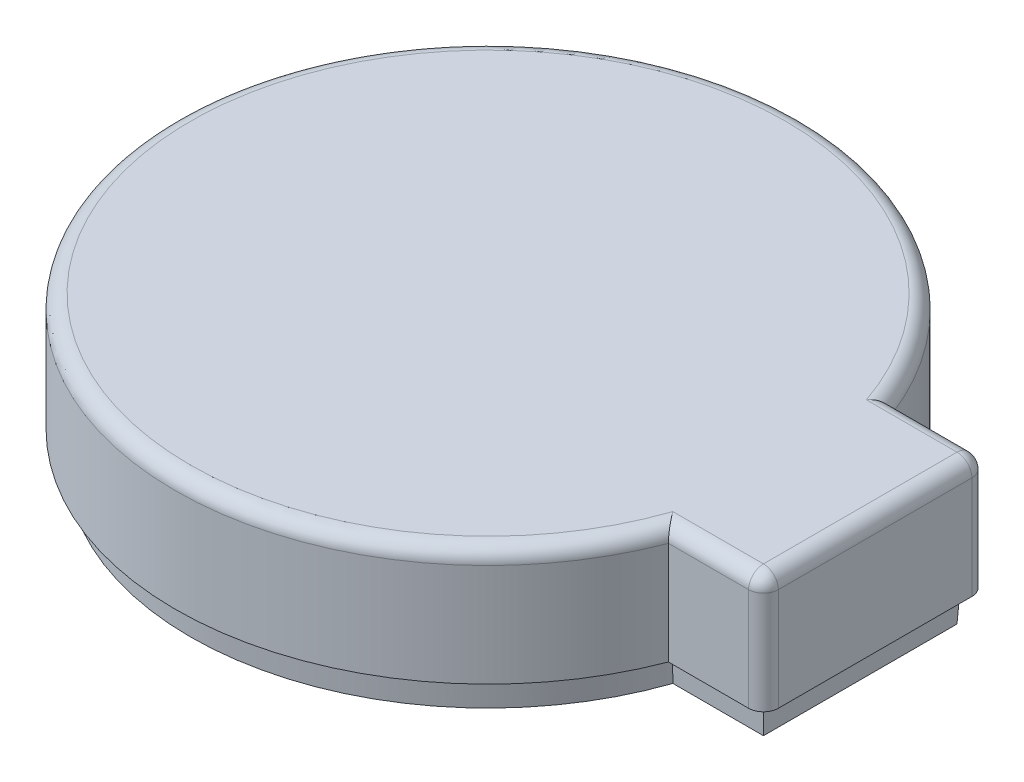
ISO-10303-21;
HEADER;
FILE_DESCRIPTION(('STEP AP214'),'2;1');
FILE_NAME('part.step','',(''),(''),'','','');
FILE_SCHEMA(('AUTOMOTIVE_DESIGN { 1 0 10303 214 1 1 1 1 }'));
ENDSEC;
DATA;
#1=APPLICATION_CONTEXT('core data for automotive mechanical design processes');
#2=APPLICATION_PROTOCOL_DEFINITION('international standard','automotive_design',2000,#1);
#3=PRODUCT_CONTEXT('',#1,'mechanical');
#4=PRODUCT('Part','Part','',(#3));
#5=PRODUCT_RELATED_PRODUCT_CATEGORY('part','',(#4));
#6=PRODUCT_DEFINITION_FORMATION('','',#4);
#7=PRODUCT_DEFINITION_CONTEXT('part definition',#1,'design');
#8=PRODUCT_DEFINITION('design','',#6,#7);
#9=PRODUCT_DEFINITION_SHAPE('','',#8);
#10=(LENGTH_UNIT() NAMED_UNIT(*) SI_UNIT(.MILLI.,.METRE.));
#11=(NAMED_UNIT(*) PLANE_ANGLE_UNIT() SI_UNIT($,.RADIAN.));
#12=(NAMED_UNIT(*) SI_UNIT($,.STERADIAN.) SOLID_ANGLE_UNIT());
#13=UNCERTAINTY_MEASURE_WITH_UNIT(LENGTH_MEASURE(1.E-05),#10,'distance_accuracy_value','');
#14=(GEOMETRIC_REPRESENTATION_CONTEXT(3) GLOBAL_UNCERTAINTY_ASSIGNED_CONTEXT((#13)) GLOBAL_UNIT_ASSIGNED_CONTEXT((#10,
#11,#12)) REPRESENTATION_CONTEXT('',''));
#15=CARTESIAN_POINT('',(0.,0.,0.));
#16=DIRECTION('',(0.,0.,1.));
#17=DIRECTION('',(1.,0.,0.));
#18=AXIS2_PLACEMENT_3D('',#15,#16,#17);
#19=CARTESIAN_POINT('',(25.,76.,-6.5));
#20=DIRECTION('',(0.,-1.,0.));
#21=DIRECTION('',(0.,0.,-1.));
#22=AXIS2_PLACEMENT_3D('',#19,#20,#21);
#23=CYLINDRICAL_SURFACE('',#22,1.);
#24=DIRECTION('',(0.,-1.,0.));
#25=VECTOR('',#24,1.);
#26=CARTESIAN_POINT('',(26.,76.,-6.5));
#27=LINE('',#26,#25);
#28=CARTESIAN_POINT('',(26.,70.1,-6.5));
#29=VERTEX_POINT('',#28);
#30=CARTESIAN_POINT('',(26.,77.,-6.5));
#31=VERTEX_POINT('',#30);
#32=EDGE_CURVE('E523',#29,#31,#27,.F.);
#33=ORIENTED_EDGE('',*,*,#32,.F.);
#34=CARTESIAN_POINT('',(25.,70.1,-6.5));
#35=DIRECTION('',(0.,-1.,0.));
#36=DIRECTION('',(0.,0.,-1.));
#37=AXIS2_PLACEMENT_3D('',#34,#35,#36);
#38=CIRCLE('',#37,1.);
#39=CARTESIAN_POINT('',(25.,70.1,-7.5));
#40=VERTEX_POINT('',#39);
#41=EDGE_CURVE('E468',#29,#40,#38,.F.);
#42=ORIENTED_EDGE('',*,*,#41,.T.);
#43=DIRECTION('',(0.,-1.,0.));
#44=VECTOR('',#43,1.);
#45=CARTESIAN_POINT('',(25.,76.,-7.5));
#46=LINE('',#45,#44);
#47=CARTESIAN_POINT('',(25.,77.,-7.5));
#48=VERTEX_POINT('',#47);
#49=EDGE_CURVE('E516',#48,#40,#46,.T.);
#50=ORIENTED_EDGE('',*,*,#49,.F.);
#51=CARTESIAN_POINT('',(25.,77.,-6.5));
#52=DIRECTION('',(0.,1.,0.));
#53=DIRECTION('',(0.,0.,1.));
#54=AXIS2_PLACEMENT_3D('',#51,#52,#53);
#55=CIRCLE('',#54,1.);
#56=EDGE_CURVE('E484',#48,#31,#55,.F.);
#57=ORIENTED_EDGE('',*,*,#56,.T.);
#58=EDGE_LOOP('',(#33,#42,#50,#57));
#59=FACE_BOUND('',#58,.T.);
#60=ADVANCED_FACE('F289',(#59),#23,.T.);
#61=CARTESIAN_POINT('',(25.,76.,6.5));
#62=DIRECTION('',(0.,1.,0.));
#63=DIRECTION('',(0.,0.,1.));
#64=AXIS2_PLACEMENT_3D('',#61,#62,#63);
#65=CYLINDRICAL_SURFACE('',#64,1.);
#66=DIRECTION('',(0.,-1.,0.));
#67=VECTOR('',#66,1.);
#68=CARTESIAN_POINT('',(25.,78.,7.5));
#69=LINE('',#68,#67);
#70=CARTESIAN_POINT('',(25.,70.1,7.5));
#71=VERTEX_POINT('',#70);
#72=CARTESIAN_POINT('',(25.,77.,7.5));
#73=VERTEX_POINT('',#72);
#74=EDGE_CURVE('E521',#71,#73,#69,.F.);
#75=ORIENTED_EDGE('',*,*,#74,.F.);
#76=CARTESIAN_POINT('',(25.,70.1,6.5));
#77=DIRECTION('',(0.,-1.,0.));
#78=DIRECTION('',(0.,0.,-1.));
#79=AXIS2_PLACEMENT_3D('',#76,#77,#78);
#80=CIRCLE('',#79,1.);
#81=CARTESIAN_POINT('',(26.,70.1,6.5));
#82=VERTEX_POINT('',#81);
#83=EDGE_CURVE('E465',#71,#82,#80,.F.);
#84=ORIENTED_EDGE('',*,*,#83,.T.);
#85=DIRECTION('',(0.,-1.,0.));
#86=VECTOR('',#85,1.);
#87=CARTESIAN_POINT('',(26.,-2.,6.5));
#88=LINE('',#87,#86);
#89=CARTESIAN_POINT('',(26.,77.,6.5));
#90=VERTEX_POINT('',#89);
#91=EDGE_CURVE('E527',#90,#82,#88,.T.);
#92=ORIENTED_EDGE('',*,*,#91,.F.);
#93=CARTESIAN_POINT('',(25.,77.,6.5));
#94=DIRECTION('',(0.,1.,0.));
#95=DIRECTION('',(0.,0.,1.));
#96=AXIS2_PLACEMENT_3D('',#93,#94,#95);
#97=CIRCLE('',#96,1.);
#98=EDGE_CURVE('E586',#90,#73,#97,.F.);
#99=ORIENTED_EDGE('',*,*,#98,.T.);
#100=EDGE_LOOP('',(#75,#84,#92,#99));
#101=FACE_BOUND('',#100,.T.);
#102=ADVANCED_FACE('F572',(#101),#65,.T.);
#103=CARTESIAN_POINT('',(26.,76.,0.));
#104=DIRECTION('',(1.,0.,0.));
#105=DIRECTION('',(0.,0.,-1.));
#106=AXIS2_PLACEMENT_3D('',#103,#104,#105);
#107=PLANE('',#106);
#108=ORIENTED_EDGE('',*,*,#91,.T.);
#109=DIRECTION('',(0.,0.,-1.));
#110=VECTOR('',#109,1.);
#111=CARTESIAN_POINT('',(26.,70.1,0.));
#112=LINE('',#111,#110);
#113=EDGE_CURVE('E471',#82,#29,#112,.T.);
#114=ORIENTED_EDGE('',*,*,#113,.T.);
#115=ORIENTED_EDGE('',*,*,#32,.T.);
#116=DIRECTION('',(0.,0.,-1.));
#117=VECTOR('',#116,1.);
#118=CARTESIAN_POINT('',(26.,77.,0.));
#119=LINE('',#118,#117);
#120=EDGE_CURVE('E525',#31,#90,#119,.F.);
#121=ORIENTED_EDGE('',*,*,#120,.T.);
#122=EDGE_LOOP('',(#108,#114,#115,#121));
#123=FACE_BOUND('',#122,.T.);
#124=ADVANCED_FACE('F574',(#123),#107,.T.);
#125=CARTESIAN_POINT('',(0.,76.,7.5));
#126=DIRECTION('',(0.,0.,-1.));
#127=DIRECTION('',(-1.,0.,0.));
#128=AXIS2_PLACEMENT_3D('',#125,#126,#127);
#129=PLANE('',#128);
#130=DIRECTION('',(-1.,0.,0.));
#131=VECTOR('',#130,1.);
#132=CARTESIAN_POINT('',(0.,70.1,7.5));
#133=LINE('',#132,#131);
#134=CARTESIAN_POINT('',(19.615045245933,70.1,7.5));
#135=VERTEX_POINT('',#134);
#136=EDGE_CURVE('E463',#71,#135,#133,.T.);
#137=ORIENTED_EDGE('',*,*,#136,.F.);
#138=ORIENTED_EDGE('',*,*,#74,.T.);
#139=DIRECTION('',(1.,0.,0.));
#140=VECTOR('',#139,1.);
#141=CARTESIAN_POINT('',(19.615045245933,77.,7.5));
#142=LINE('',#141,#140);
#143=CARTESIAN_POINT('',(19.615045245933,77.,7.5));
#144=VERTEX_POINT('',#143);
#145=EDGE_CURVE('E519',#73,#144,#142,.F.);
#146=ORIENTED_EDGE('',*,*,#145,.T.);
#147=DIRECTION('',(0.,-1.,0.));
#148=VECTOR('',#147,1.);
#149=CARTESIAN_POINT('',(19.615045245933,76.,7.5));
#150=LINE('',#149,#148);
#151=EDGE_CURVE('E497',#144,#135,#150,.T.);
#152=ORIENTED_EDGE('',*,*,#151,.T.);
#153=EDGE_LOOP('',(#137,#138,#146,#152));
#154=FACE_BOUND('',#153,.T.);
#155=ADVANCED_FACE('F624',(#154),#129,.F.);
#156=CARTESIAN_POINT('',(0.,76.,0.));
#157=DIRECTION('',(0.,-1.,0.));
#158=DIRECTION('',(0.,0.,-1.));
#159=AXIS2_PLACEMENT_3D('',#156,#157,#158);
#160=CYLINDRICAL_SURFACE('',#159,21.);
#161=CARTESIAN_POINT('',(0.,70.1,0.));
#162=DIRECTION('',(0.,-1.,0.));
#163=DIRECTION('',(0.,0.,-1.));
#164=AXIS2_PLACEMENT_3D('',#161,#162,#163);
#165=CIRCLE('',#164,21.);
#166=CARTESIAN_POINT('',(19.615045245933,70.1,-7.5));
#167=VERTEX_POINT('',#166);
#168=EDGE_CURVE('E304',#135,#167,#165,.T.);
#169=ORIENTED_EDGE('',*,*,#168,.F.);
#170=ORIENTED_EDGE('',*,*,#151,.F.);
#171=CARTESIAN_POINT('',(0.,77.,0.));
#172=DIRECTION('',(0.,1.,0.));
#173=DIRECTION('',(0.,0.,1.));
#174=AXIS2_PLACEMENT_3D('',#171,#172,#173);
#175=CIRCLE('',#174,21.);
#176=CARTESIAN_POINT('',(19.615045245933,77.,-7.5));
#177=VERTEX_POINT('',#176);
#178=EDGE_CURVE('E297',#144,#177,#175,.F.);
#179=ORIENTED_EDGE('',*,*,#178,.T.);
#180=DIRECTION('',(0.,-1.,0.));
#181=VECTOR('',#180,1.);
#182=CARTESIAN_POINT('',(19.615045245933,76.,-7.5));
#183=LINE('',#182,#181);
#184=EDGE_CURVE('E500',#177,#167,#183,.T.);
#185=ORIENTED_EDGE('',*,*,#184,.T.);
#186=EDGE_LOOP('',(#169,#170,#179,#185));
#187=FACE_BOUND('',#186,.T.);
#188=ADVANCED_FACE('F612',(#187),#160,.T.);
#189=CARTESIAN_POINT('',(0.,76.,-7.5));
#190=DIRECTION('',(0.,0.,-1.));
#191=DIRECTION('',(-1.,0.,0.));
#192=AXIS2_PLACEMENT_3D('',#189,#190,#191);
#193=PLANE('',#192);
#194=ORIENTED_EDGE('',*,*,#49,.T.);
#195=DIRECTION('',(-1.,0.,0.));
#196=VECTOR('',#195,1.);
#197=CARTESIAN_POINT('',(0.,70.1,-7.5));
#198=LINE('',#197,#196);
#199=EDGE_CURVE('E13',#40,#167,#198,.T.);
#200=ORIENTED_EDGE('',*,*,#199,.T.);
#201=ORIENTED_EDGE('',*,*,#184,.F.);
#202=DIRECTION('',(-1.,0.,0.));
#203=VECTOR('',#202,1.);
#204=CARTESIAN_POINT('',(0.,77.,-7.5));
#205=LINE('',#204,#203);
#206=EDGE_CURVE('E504',#177,#48,#205,.F.);
#207=ORIENTED_EDGE('',*,*,#206,.T.);
#208=EDGE_LOOP('',(#194,#200,#201,#207));
#209=FACE_BOUND('',#208,.T.);
#210=ADVANCED_FACE('F614',(#209),#193,.T.);
#211=CARTESIAN_POINT('',(0.,78.,0.));
#212=DIRECTION('',(0.,1.,0.));
#213=DIRECTION('',(0.,0.,1.));
#214=AXIS2_PLACEMENT_3D('',#211,#212,#213);
#215=PLANE('',#214);
#216=DIRECTION('',(1.,0.,0.));
#217=VECTOR('',#216,1.);
#218=CARTESIAN_POINT('',(26.,78.,6.5));
#219=LINE('',#218,#217);
#220=CARTESIAN_POINT('',(18.9142803193777,78.,6.5));
#221=VERTEX_POINT('',#220);
#222=CARTESIAN_POINT('',(25.,78.,6.5));
#223=VERTEX_POINT('',#222);
#224=EDGE_CURVE('E534',#221,#223,#219,.T.);
#225=ORIENTED_EDGE('',*,*,#224,.T.);
#226=DIRECTION('',(0.,0.,-1.));
#227=VECTOR('',#226,1.);
#228=CARTESIAN_POINT('',(25.,78.,0.));
#229=LINE('',#228,#227);
#230=CARTESIAN_POINT('',(25.,78.,-6.5));
#231=VERTEX_POINT('',#230);
#232=EDGE_CURVE('E536',#223,#231,#229,.T.);
#233=ORIENTED_EDGE('',*,*,#232,.T.);
#234=DIRECTION('',(-1.,0.,0.));
#235=VECTOR('',#234,1.);
#236=CARTESIAN_POINT('',(0.,78.,-6.5));
#237=LINE('',#236,#235);
#238=CARTESIAN_POINT('',(18.9142803193777,78.,-6.5));
#239=VERTEX_POINT('',#238);
#240=EDGE_CURVE('E532',#231,#239,#237,.T.);
#241=ORIENTED_EDGE('',*,*,#240,.T.);
#242=CARTESIAN_POINT('',(0.,78.,0.));
#243=DIRECTION('',(0.,1.,0.));
#244=DIRECTION('',(0.,0.,1.));
#245=AXIS2_PLACEMENT_3D('',#242,#243,#244);
#246=CIRCLE('',#245,20.);
#247=EDGE_CURVE('E530',#239,#221,#246,.T.);
#248=ORIENTED_EDGE('',*,*,#247,.T.);
#249=EDGE_LOOP('',(#225,#233,#241,#248));
#250=FACE_BOUND('',#249,.T.);
#251=ADVANCED_FACE('F565',(#250),#215,.T.);
#252=CARTESIAN_POINT('',(0.,77.,-6.5));
#253=DIRECTION('',(-1.,0.,0.));
#254=DIRECTION('',(0.,0.,1.));
#255=AXIS2_PLACEMENT_3D('',#252,#253,#254);
#256=CYLINDRICAL_SURFACE('',#255,1.);
#257=CARTESIAN_POINT('',(19.615045245933,77.,-7.5));
#258=CARTESIAN_POINT('',(19.6150464901498,77.0245913883514,-7.50000195074469));
#259=CARTESIAN_POINT('',(19.6144204421989,77.049169455449,-7.49909216770085));
#260=CARTESIAN_POINT('',(19.6119320594645,77.0981199397787,-7.49547691718047));
#261=CARTESIAN_POINT('',(19.6100702475772,77.1224924395784,-7.49277220920138));
#262=CARTESIAN_POINT('',(19.6026878164083,77.1947705444246,-7.48204978646102));
#263=CARTESIAN_POINT('',(19.5953696888519,77.2421395994663,-7.47142300065398));
#264=CARTESIAN_POINT('',(19.5763404742697,77.33393471167,-7.44381546415088));
#265=CARTESIAN_POINT('',(19.5646349450327,77.3783644088734,-7.4268427522926));
#266=CARTESIAN_POINT('',(19.537373263556,77.4634561435416,-7.38736180159154));
#267=CARTESIAN_POINT('',(19.5218128624886,77.5041139552225,-7.36484745495401));
#268=CARTESIAN_POINT('',(19.4863706136538,77.5833992284021,-7.31364100918386));
#269=CARTESIAN_POINT('',(19.4662781782195,77.6217371167018,-7.28464893557632));
#270=CARTESIAN_POINT('',(19.4231407350394,77.6929697069104,-7.22251594235774));
#271=CARTESIAN_POINT('',(19.400094988175,77.7258630414845,-7.18937398421209));
#272=CARTESIAN_POINT('',(19.3476213070707,77.7910797850254,-7.11406124326996));
#273=CARTESIAN_POINT('',(19.3177705525009,77.8223881827772,-7.07130738047668));
#274=CARTESIAN_POINT('',(19.2557258167357,77.8773582086508,-6.98266710364924));
#275=CARTESIAN_POINT('',(19.2235292504516,77.9010112394917,-6.93677723729668));
#276=CARTESIAN_POINT('',(19.1515447819292,77.9443325286028,-6.83445002303998));
#277=CARTESIAN_POINT('',(19.1114370321131,77.9625065233977,-6.77760607226738));
#278=CARTESIAN_POINT('',(19.0300037501768,77.9884535192871,-6.66256994521675));
#279=CARTESIAN_POINT('',(18.988680282891,77.9962432207276,-6.60438008720164));
#280=CARTESIAN_POINT('',(18.9374949570389,77.9995634848672,-6.53254148535724));
#281=CARTESIAN_POINT('',(18.9277796966127,77.9999138876318,-6.51891665325401));
#282=CARTESIAN_POINT('',(18.9167990659669,77.9999953276404,-6.50352908627626));
#283=CARTESIAN_POINT('',(18.9155397417105,77.9999999974932,-6.50176452402142));
#284=CARTESIAN_POINT('',(18.9142803193777,78.,-6.5));
#285=B_SPLINE_CURVE_WITH_KNOTS('',3,(#257,#258,#259,#260,#261,#262,#263,#264,#265,#266,#267,
#268,#269,#270,#271,#272,#273,#274,#275,#276,#277,#278,#279,#280,#281,#282,#283,#284),
.UNSPECIFIED.,.F.,.F.,(4,2,2,2,2,2,2,2,2,2,2,2,2,4),(0.,0.073723631162768,0.147416087072646,
0.293905282465476,0.44020953481274,0.586675766339752,0.742375312783305,0.898113902182855,
1.07989412202351,1.26187778555274,1.47677325615916,1.69132270651525,1.74153133340873,
1.7480348925106),.UNSPECIFIED.);
#286=EDGE_CURVE('E547',#177,#239,#285,.T.);
#287=ORIENTED_EDGE('',*,*,#286,.T.);
#288=ORIENTED_EDGE('',*,*,#240,.F.);
#289=CARTESIAN_POINT('',(25.,77.,-6.5));
#290=DIRECTION('',(1.,0.,0.));
#291=DIRECTION('',(0.,0.,-1.));
#292=AXIS2_PLACEMENT_3D('',#289,#290,#291);
#293=CIRCLE('',#292,1.);
#294=EDGE_CURVE('E542',#48,#231,#293,.T.);
#295=ORIENTED_EDGE('',*,*,#294,.F.);
#296=ORIENTED_EDGE('',*,*,#206,.F.);
#297=EDGE_LOOP('',(#287,#288,#295,#296));
#298=FACE_BOUND('',#297,.T.);
#299=ADVANCED_FACE('F561',(#298),#256,.T.);
#300=CARTESIAN_POINT('',(0.,77.,0.));
#301=DIRECTION('',(0.,1.,0.));
#302=DIRECTION('',(0.,0.,1.));
#303=AXIS2_PLACEMENT_3D('',#300,#301,#302);
#304=TOROIDAL_SURFACE('',#303,20.,1.);
#305=CARTESIAN_POINT('',(19.615045245933,77.,7.5));
#306=CARTESIAN_POINT('',(19.6150464901498,77.0245913883515,7.50000195074469));
#307=CARTESIAN_POINT('',(19.6144204421989,77.049169455449,7.49909216770085));
#308=CARTESIAN_POINT('',(19.6119320594645,77.0981199397787,7.49547691718047));
#309=CARTESIAN_POINT('',(19.6100702475772,77.1224924395784,7.49277220920137));
#310=CARTESIAN_POINT('',(19.6026878164083,77.1947705444246,7.48204978646102));
#311=CARTESIAN_POINT('',(19.5953696888519,77.2421395994663,7.47142300065398));
#312=CARTESIAN_POINT('',(19.5763404742697,77.33393471167,7.44381546415088));
#313=CARTESIAN_POINT('',(19.5646349450327,77.3783644088734,7.4268427522926));
#314=CARTESIAN_POINT('',(19.537373263556,77.4634561435416,7.38736180159154));
#315=CARTESIAN_POINT('',(19.5218128624886,77.5041139552225,7.36484745495401));
#316=CARTESIAN_POINT('',(19.4863706136538,77.5833992284021,7.31364100918385));
#317=CARTESIAN_POINT('',(19.4662781782195,77.6217371167018,7.28464893557632));
#318=CARTESIAN_POINT('',(19.4231407350394,77.6929697069104,7.22251594235775));
#319=CARTESIAN_POINT('',(19.400094988175,77.7258630414845,7.18937398421209));
#320=CARTESIAN_POINT('',(19.3476213070707,77.7910797850254,7.11406124326997));
#321=CARTESIAN_POINT('',(19.3177705525009,77.8223881827772,7.07130738047669));
#322=CARTESIAN_POINT('',(19.2557258167357,77.8773582086507,6.98266710364924));
#323=CARTESIAN_POINT('',(19.2235292504516,77.9010112394917,6.93677723729668));
#324=CARTESIAN_POINT('',(19.1515447819292,77.9443325286028,6.83445002303997));
#325=CARTESIAN_POINT('',(19.1114370321131,77.9625065233977,6.77760607226737));
#326=CARTESIAN_POINT('',(19.0300037501768,77.9884535192871,6.66256994521675));
#327=CARTESIAN_POINT('',(18.988680282891,77.9962432207276,6.60438008720164));
#328=CARTESIAN_POINT('',(18.9374949570389,77.9995634848672,6.53254148535724));
#329=CARTESIAN_POINT('',(18.9277796966127,77.9999138876318,6.51891665325401));
#330=CARTESIAN_POINT('',(18.9167990659669,77.9999953276404,6.50352908627626));
#331=CARTESIAN_POINT('',(18.9155397417105,77.9999999974932,6.50176452402141));
#332=CARTESIAN_POINT('',(18.9142803193777,78.,6.5));
#333=B_SPLINE_CURVE_WITH_KNOTS('',3,(#305,#306,#307,#308,#309,#310,#311,#312,#313,#314,#315,
#316,#317,#318,#319,#320,#321,#322,#323,#324,#325,#326,#327,#328,#329,#330,#331,#332),
.UNSPECIFIED.,.F.,.F.,(4,2,2,2,2,2,2,2,2,2,2,2,2,4),(0.,0.0737236311627818,0.147416087072646,
0.293905282465476,0.44020953481274,0.586675766339752,0.742375312783303,0.898113902182835,
1.07989412202349,1.26187778555274,1.47677325615916,1.69132270651525,1.74153133340873,
1.7480348925106),.UNSPECIFIED.);
#334=EDGE_CURVE('E580',#144,#221,#333,.T.);
#335=ORIENTED_EDGE('',*,*,#334,.T.);
#336=ORIENTED_EDGE('',*,*,#247,.F.);
#337=ORIENTED_EDGE('',*,*,#286,.F.);
#338=ORIENTED_EDGE('',*,*,#178,.F.);
#339=EDGE_LOOP('',(#335,#336,#337,#338));
#340=FACE_BOUND('',#339,.T.);
#341=ADVANCED_FACE('F558',(#340),#304,.T.);
#342=CARTESIAN_POINT('',(0.,77.,6.5));
#343=DIRECTION('',(-1.,0.,0.));
#344=DIRECTION('',(0.,0.,1.));
#345=AXIS2_PLACEMENT_3D('',#342,#343,#344);
#346=CYLINDRICAL_SURFACE('',#345,1.);
#347=ORIENTED_EDGE('',*,*,#334,.F.);
#348=ORIENTED_EDGE('',*,*,#145,.F.);
#349=CARTESIAN_POINT('',(25.,77.,6.5));
#350=DIRECTION('',(1.,0.,0.));
#351=DIRECTION('',(0.,0.,-1.));
#352=AXIS2_PLACEMENT_3D('',#349,#350,#351);
#353=CIRCLE('',#352,1.);
#354=EDGE_CURVE('E489',#223,#73,#353,.T.);
#355=ORIENTED_EDGE('',*,*,#354,.F.);
#356=ORIENTED_EDGE('',*,*,#224,.F.);
#357=EDGE_LOOP('',(#347,#348,#355,#356));
#358=FACE_BOUND('',#357,.T.);
#359=ADVANCED_FACE('F570',(#358),#346,.T.);
#360=CARTESIAN_POINT('',(25.,77.,0.));
#361=DIRECTION('',(0.,0.,-1.));
#362=DIRECTION('',(-1.,0.,0.));
#363=AXIS2_PLACEMENT_3D('',#360,#361,#362);
#364=CYLINDRICAL_SURFACE('',#363,1.);
#365=CARTESIAN_POINT('',(25.,77.,6.5));
#366=DIRECTION('',(0.,0.,1.));
#367=DIRECTION('',(1.,0.,0.));
#368=AXIS2_PLACEMENT_3D('',#365,#366,#367);
#369=CIRCLE('',#368,1.);
#370=EDGE_CURVE('E556',#223,#90,#369,.F.);
#371=ORIENTED_EDGE('',*,*,#370,.T.);
#372=ORIENTED_EDGE('',*,*,#120,.F.);
#373=CARTESIAN_POINT('',(25.,77.,-6.5));
#374=DIRECTION('',(0.,0.,-1.));
#375=DIRECTION('',(-1.,0.,0.));
#376=AXIS2_PLACEMENT_3D('',#373,#374,#375);
#377=CIRCLE('',#376,1.);
#378=EDGE_CURVE('E544',#231,#31,#377,.T.);
#379=ORIENTED_EDGE('',*,*,#378,.F.);
#380=ORIENTED_EDGE('',*,*,#232,.F.);
#381=EDGE_LOOP('',(#371,#372,#379,#380));
#382=FACE_BOUND('',#381,.T.);
#383=ADVANCED_FACE('F567',(#382),#364,.T.);
#384=CARTESIAN_POINT('',(25.,77.,6.5));
#385=DIRECTION('',(0.,0.,1.));
#386=DIRECTION('',(1.,0.,0.));
#387=AXIS2_PLACEMENT_3D('',#384,#385,#386);
#388=SPHERICAL_SURFACE('',#387,1.);
#389=ORIENTED_EDGE('',*,*,#370,.F.);
#390=ORIENTED_EDGE('',*,*,#354,.T.);
#391=ORIENTED_EDGE('',*,*,#98,.F.);
#392=EDGE_LOOP('',(#389,#390,#391));
#393=FACE_BOUND('',#392,.T.);
#394=ADVANCED_FACE('F291',(#393),#388,.T.);
#395=CARTESIAN_POINT('',(25.,77.,-6.5));
#396=DIRECTION('',(0.,0.,1.));
#397=DIRECTION('',(1.,0.,0.));
#398=AXIS2_PLACEMENT_3D('',#395,#396,#397);
#399=SPHERICAL_SURFACE('',#398,1.);
#400=ORIENTED_EDGE('',*,*,#294,.T.);
#401=ORIENTED_EDGE('',*,*,#378,.T.);
#402=ORIENTED_EDGE('',*,*,#56,.F.);
#403=EDGE_LOOP('',(#400,#401,#402));
#404=FACE_BOUND('',#403,.T.);
#405=ADVANCED_FACE('F641',(#404),#399,.T.);
#406=CARTESIAN_POINT('',(25.,68.,0.));
#407=DIRECTION('',(-0.998629534754574,0.0523359562429438,0.));
#408=DIRECTION('',(-0.0523359562429438,-0.998629534754574,0.));
#409=AXIS2_PLACEMENT_3D('',#406,#407,#408);
#410=PLANE('',#409);
#411=DIRECTION('',(0.,0.,1.));
#412=VECTOR('',#411,1.);
#413=CARTESIAN_POINT('',(25.,68.,0.));
#414=LINE('',#413,#412);
#415=CARTESIAN_POINT('',(25.,68.,-6.5));
#416=VERTEX_POINT('',#415);
#417=CARTESIAN_POINT('',(25.,68.,6.5));
#418=VERTEX_POINT('',#417);
#419=EDGE_CURVE('E416',#416,#418,#414,.T.);
#420=ORIENTED_EDGE('',*,*,#419,.F.);
#421=DIRECTION('',(-0.0522644276887139,-0.997264688634237,0.0522644276887139));
#422=VECTOR('',#421,1.);
#423=CARTESIAN_POINT('',(24.9317107399593,66.6969632948592,-6.43171073995928));
#424=LINE('',#423,#422);
#425=CARTESIAN_POINT('',(25.1100563364944,70.1,-6.61005633649439));
#426=VERTEX_POINT('',#425);
#427=EDGE_CURVE('E407',#426,#416,#424,.T.);
#428=ORIENTED_EDGE('',*,*,#427,.F.);
#429=DIRECTION('',(0.,0.,-1.));
#430=VECTOR('',#429,1.);
#431=CARTESIAN_POINT('',(25.1100563364944,70.1,0.));
#432=LINE('',#431,#430);
#433=CARTESIAN_POINT('',(25.1100563364944,70.1,6.61005633649439));
#434=VERTEX_POINT('',#433);
#435=EDGE_CURVE('E455',#426,#434,#432,.F.);
#436=ORIENTED_EDGE('',*,*,#435,.T.);
#437=DIRECTION('',(0.0522644276887139,0.997264688634237,0.0522644276887139));
#438=VECTOR('',#437,1.);
#439=CARTESIAN_POINT('',(24.9317107399593,66.6969632948592,6.43171073995928));
#440=LINE('',#439,#438);
#441=EDGE_CURVE('E433',#434,#418,#440,.F.);
#442=ORIENTED_EDGE('',*,*,#441,.T.);
#443=EDGE_LOOP('',(#420,#428,#436,#442));
#444=FACE_BOUND('',#443,.T.);
#445=ADVANCED_FACE('F440',(#444),#410,.F.);
#446=CARTESIAN_POINT('',(0.,68.,-6.5));
#447=DIRECTION('',(0.,0.0523359562429438,0.998629534754574));
#448=DIRECTION('',(0.,-0.998629534754574,0.0523359562429438));
#449=AXIS2_PLACEMENT_3D('',#446,#447,#448);
#450=PLANE('',#449);
#451=DIRECTION('',(1.,0.,0.));
#452=VECTOR('',#451,1.);
#453=CARTESIAN_POINT('',(0.,68.,-6.5));
#454=LINE('',#453,#452);
#455=CARTESIAN_POINT('',(18.9142803193777,68.,-6.5));
#456=VERTEX_POINT('',#455);
#457=EDGE_CURVE('E411',#456,#416,#454,.T.);
#458=ORIENTED_EDGE('',*,*,#457,.F.);
#459=CARTESIAN_POINT('',(18.9926701936655,70.1,-6.61005633649439));
#460=CARTESIAN_POINT('',(18.979632194891,69.7499989956266,-6.59171356110834));
#461=CARTESIAN_POINT('',(18.9665807059798,69.3999984934406,-6.57337081204082));
#462=CARTESIAN_POINT('',(18.9404507478839,68.6999984934406,-6.53668536654269));
#463=CARTESIAN_POINT('',(18.9273722786992,68.3499989956266,-6.51834267011208));
#464=CARTESIAN_POINT('',(18.9142803193777,68.,-6.5));
#465=B_SPLINE_CURVE_WITH_KNOTS('',3,(#459,#460,#461,#462,#463,#464),.UNSPECIFIED.,.F.,.F.,(4,2,
4),(0.,1.05217125223487,2.10434250447829),.UNSPECIFIED.);
#466=CARTESIAN_POINT('',(18.9926701936655,70.1,-6.61005633649439));
#467=VERTEX_POINT('',#466);
#468=EDGE_CURVE('E399',#467,#456,#465,.T.);
#469=ORIENTED_EDGE('',*,*,#468,.F.);
#470=DIRECTION('',(-1.,0.,0.));
#471=VECTOR('',#470,1.);
#472=CARTESIAN_POINT('',(0.,70.1,-6.61005633649439));
#473=LINE('',#472,#471);
#474=EDGE_CURVE('E453',#467,#426,#473,.F.);
#475=ORIENTED_EDGE('',*,*,#474,.T.);
#476=ORIENTED_EDGE('',*,*,#427,.T.);
#477=EDGE_LOOP('',(#458,#469,#475,#476));
#478=FACE_BOUND('',#477,.T.);
#479=ADVANCED_FACE('F412',(#478),#450,.F.);
#480=CARTESIAN_POINT('',(0.,68.,0.));
#481=DIRECTION('',(0.,1.,0.));
#482=DIRECTION('',(0.,0.,-1.));
#483=AXIS2_PLACEMENT_3D('',#480,#481,#482);
#484=CONICAL_SURFACE('',#483,20.,0.0523598775598298);
#485=CARTESIAN_POINT('',(0.,68.,0.));
#486=DIRECTION('',(0.,-1.,0.));
#487=DIRECTION('',(0.,0.,-1.));
#488=AXIS2_PLACEMENT_3D('',#485,#486,#487);
#489=CIRCLE('',#488,20.);
#490=CARTESIAN_POINT('',(18.9142803193777,68.,6.5));
#491=VERTEX_POINT('',#490);
#492=EDGE_CURVE('E311',#456,#491,#489,.F.);
#493=ORIENTED_EDGE('',*,*,#492,.T.);
#494=CARTESIAN_POINT('',(18.9926701936655,70.1,6.61005633649438));
#495=CARTESIAN_POINT('',(18.979632194891,69.7499989956266,6.59171356110834));
#496=CARTESIAN_POINT('',(18.9665807059798,69.3999984934406,6.57337081204082));
#497=CARTESIAN_POINT('',(18.9404507478839,68.6999984934406,6.53668536654269));
#498=CARTESIAN_POINT('',(18.9273722786992,68.3499989956266,6.51834267011208));
#499=CARTESIAN_POINT('',(18.9142803193777,68.,6.5));
#500=B_SPLINE_CURVE_WITH_KNOTS('',3,(#494,#495,#496,#497,#498,#499),.UNSPECIFIED.,.F.,.F.,(4,2,
4),(0.,1.05217125223487,2.10434250447829),.UNSPECIFIED.);
#501=CARTESIAN_POINT('',(18.9926701936655,70.1,6.61005633649438));
#502=VERTEX_POINT('',#501);
#503=EDGE_CURVE('E408',#502,#491,#500,.T.);
#504=ORIENTED_EDGE('',*,*,#503,.F.);
#505=CARTESIAN_POINT('',(0.,70.1,0.));
#506=DIRECTION('',(0.,-1.,0.));
#507=DIRECTION('',(0.,0.,-1.));
#508=AXIS2_PLACEMENT_3D('',#505,#506,#507);
#509=CIRCLE('',#508,20.1100563364944);
#510=EDGE_CURVE('E403',#467,#502,#509,.F.);
#511=ORIENTED_EDGE('',*,*,#510,.F.);
#512=ORIENTED_EDGE('',*,*,#468,.T.);
#513=EDGE_LOOP('',(#493,#504,#511,#512));
#514=FACE_BOUND('',#513,.T.);
#515=ADVANCED_FACE('F401',(#514),#484,.T.);
#516=CARTESIAN_POINT('',(0.,68.,6.5));
#517=DIRECTION('',(0.,0.0523359562429438,-0.998629534754574));
#518=DIRECTION('',(0.,0.998629534754574,0.0523359562429438));
#519=AXIS2_PLACEMENT_3D('',#516,#517,#518);
#520=PLANE('',#519);
#521=DIRECTION('',(1.,0.,0.));
#522=VECTOR('',#521,1.);
#523=CARTESIAN_POINT('',(0.,68.,6.5));
#524=LINE('',#523,#522);
#525=EDGE_CURVE('E421',#491,#418,#524,.T.);
#526=ORIENTED_EDGE('',*,*,#525,.T.);
#527=ORIENTED_EDGE('',*,*,#441,.F.);
#528=DIRECTION('',(1.,0.,0.));
#529=VECTOR('',#528,1.);
#530=CARTESIAN_POINT('',(0.,70.1,6.61005633649438));
#531=LINE('',#530,#529);
#532=EDGE_CURVE('E458',#502,#434,#531,.T.);
#533=ORIENTED_EDGE('',*,*,#532,.F.);
#534=ORIENTED_EDGE('',*,*,#503,.T.);
#535=EDGE_LOOP('',(#526,#527,#533,#534));
#536=FACE_BOUND('',#535,.T.);
#537=ADVANCED_FACE('F441',(#536),#520,.F.);
#538=CARTESIAN_POINT('',(0.,70.1,0.));
#539=DIRECTION('',(0.,-1.,0.));
#540=DIRECTION('',(0.,0.,-1.));
#541=AXIS2_PLACEMENT_3D('',#538,#539,#540);
#542=PLANE('',#541);
#543=ORIENTED_EDGE('',*,*,#83,.F.);
#544=ORIENTED_EDGE('',*,*,#136,.T.);
#545=ORIENTED_EDGE('',*,*,#168,.T.);
#546=ORIENTED_EDGE('',*,*,#199,.F.);
#547=ORIENTED_EDGE('',*,*,#41,.F.);
#548=ORIENTED_EDGE('',*,*,#113,.F.);
#549=EDGE_LOOP('',(#543,#544,#545,#546,#547,#548));
#550=FACE_BOUND('',#549,.T.);
#551=ORIENTED_EDGE('',*,*,#435,.F.);
#552=ORIENTED_EDGE('',*,*,#474,.F.);
#553=ORIENTED_EDGE('',*,*,#510,.T.);
#554=ORIENTED_EDGE('',*,*,#532,.T.);
#555=EDGE_LOOP('',(#551,#552,#553,#554));
#556=FACE_BOUND('',#555,.T.);
#557=ADVANCED_FACE('F445',(#550,#556),#542,.T.);
#558=CARTESIAN_POINT('',(0.,76.,0.));
#559=DIRECTION('',(0.,1.,0.));
#560=DIRECTION('',(0.,0.,1.));
#561=AXIS2_PLACEMENT_3D('',#558,#559,#560);
#562=PLANE('',#561);
#563=CARTESIAN_POINT('',(0.,76.,0.));
#564=DIRECTION('',(0.,1.,0.));
#565=DIRECTION('',(0.,0.,1.));
#566=AXIS2_PLACEMENT_3D('',#563,#564,#565);
#567=CIRCLE('',#566,19.);
#568=CARTESIAN_POINT('',(18.1865334794732,76.,-5.5));
#569=VERTEX_POINT('',#568);
#570=CARTESIAN_POINT('',(18.1865334794732,76.,5.5));
#571=VERTEX_POINT('',#570);
#572=EDGE_CURVE('E485',#569,#571,#567,.T.);
#573=ORIENTED_EDGE('',*,*,#572,.F.);
#574=DIRECTION('',(1.,0.,0.));
#575=VECTOR('',#574,1.);
#576=CARTESIAN_POINT('',(0.,76.,-5.5));
#577=LINE('',#576,#575);
#578=CARTESIAN_POINT('',(24.,76.,-5.5));
#579=VERTEX_POINT('',#578);
#580=EDGE_CURVE('E488',#569,#579,#577,.T.);
#581=ORIENTED_EDGE('',*,*,#580,.T.);
#582=DIRECTION('',(0.,0.,1.));
#583=VECTOR('',#582,1.);
#584=CARTESIAN_POINT('',(24.,76.,0.));
#585=LINE('',#584,#583);
#586=CARTESIAN_POINT('',(24.,76.,5.5));
#587=VERTEX_POINT('',#586);
#588=EDGE_CURVE('E491',#579,#587,#585,.T.);
#589=ORIENTED_EDGE('',*,*,#588,.T.);
#590=DIRECTION('',(1.,0.,0.));
#591=VECTOR('',#590,1.);
#592=CARTESIAN_POINT('',(0.,76.,5.5));
#593=LINE('',#592,#591);
#594=EDGE_CURVE('E493',#571,#587,#593,.T.);
#595=ORIENTED_EDGE('',*,*,#594,.F.);
#596=EDGE_LOOP('',(#573,#581,#589,#595));
#597=FACE_BOUND('',#596,.T.);
#598=ADVANCED_FACE('F681',(#597),#562,.F.);
#599=CARTESIAN_POINT('',(0.,76.,-5.5));
#600=DIRECTION('',(0.,0.,-1.));
#601=DIRECTION('',(-1.,0.,0.));
#602=AXIS2_PLACEMENT_3D('',#599,#600,#601);
#603=PLANE('',#602);
#604=DIRECTION('',(1.,0.,0.));
#605=VECTOR('',#604,1.);
#606=CARTESIAN_POINT('',(0.,68.,-5.5));
#607=LINE('',#606,#605);
#608=CARTESIAN_POINT('',(18.1865334794732,68.,-5.5));
#609=VERTEX_POINT('',#608);
#610=CARTESIAN_POINT('',(24.,68.,-5.5));
#611=VERTEX_POINT('',#610);
#612=EDGE_CURVE('E481',#609,#611,#607,.T.);
#613=ORIENTED_EDGE('',*,*,#612,.T.);
#614=DIRECTION('',(0.,-1.,0.));
#615=VECTOR('',#614,1.);
#616=CARTESIAN_POINT('',(24.,76.,-5.5));
#617=LINE('',#616,#615);
#618=EDGE_CURVE('E510',#579,#611,#617,.T.);
#619=ORIENTED_EDGE('',*,*,#618,.F.);
#620=ORIENTED_EDGE('',*,*,#580,.F.);
#621=DIRECTION('',(0.,-1.,0.));
#622=VECTOR('',#621,1.);
#623=CARTESIAN_POINT('',(18.1865334794732,76.,-5.5));
#624=LINE('',#623,#622);
#625=EDGE_CURVE('E501',#569,#609,#624,.T.);
#626=ORIENTED_EDGE('',*,*,#625,.T.);
#627=EDGE_LOOP('',(#613,#619,#620,#626));
#628=FACE_BOUND('',#627,.T.);
#629=ADVANCED_FACE('F684',(#628),#603,.F.);
#630=CARTESIAN_POINT('',(24.,76.,0.));
#631=DIRECTION('',(1.,0.,0.));
#632=DIRECTION('',(0.,0.,-1.));
#633=AXIS2_PLACEMENT_3D('',#630,#631,#632);
#634=PLANE('',#633);
#635=DIRECTION('',(0.,0.,1.));
#636=VECTOR('',#635,1.);
#637=CARTESIAN_POINT('',(24.,68.,0.));
#638=LINE('',#637,#636);
#639=CARTESIAN_POINT('',(24.,68.,5.5));
#640=VERTEX_POINT('',#639);
#641=EDGE_CURVE('E478',#611,#640,#638,.T.);
#642=ORIENTED_EDGE('',*,*,#641,.T.);
#643=DIRECTION('',(0.,-1.,0.));
#644=VECTOR('',#643,1.);
#645=CARTESIAN_POINT('',(24.,76.,5.5));
#646=LINE('',#645,#644);
#647=EDGE_CURVE('E507',#587,#640,#646,.T.);
#648=ORIENTED_EDGE('',*,*,#647,.F.);
#649=ORIENTED_EDGE('',*,*,#588,.F.);
#650=ORIENTED_EDGE('',*,*,#618,.T.);
#651=EDGE_LOOP('',(#642,#648,#649,#650));
#652=FACE_BOUND('',#651,.T.);
#653=ADVANCED_FACE('F795',(#652),#634,.F.);
#654=CARTESIAN_POINT('',(0.,76.,5.5));
#655=DIRECTION('',(0.,0.,-1.));
#656=DIRECTION('',(-1.,0.,0.));
#657=AXIS2_PLACEMENT_3D('',#654,#655,#656);
#658=PLANE('',#657);
#659=ORIENTED_EDGE('',*,*,#647,.T.);
#660=DIRECTION('',(1.,0.,0.));
#661=VECTOR('',#660,1.);
#662=CARTESIAN_POINT('',(0.,68.,5.5));
#663=LINE('',#662,#661);
#664=CARTESIAN_POINT('',(18.1865334794732,68.,5.5));
#665=VERTEX_POINT('',#664);
#666=EDGE_CURVE('E474',#665,#640,#663,.T.);
#667=ORIENTED_EDGE('',*,*,#666,.F.);
#668=DIRECTION('',(0.,-1.,0.));
#669=VECTOR('',#668,1.);
#670=CARTESIAN_POINT('',(18.1865334794732,76.,5.5));
#671=LINE('',#670,#669);
#672=EDGE_CURVE('E496',#571,#665,#671,.T.);
#673=ORIENTED_EDGE('',*,*,#672,.F.);
#674=ORIENTED_EDGE('',*,*,#594,.T.);
#675=EDGE_LOOP('',(#659,#667,#673,#674));
#676=FACE_BOUND('',#675,.T.);
#677=ADVANCED_FACE('F692',(#676),#658,.T.);
#678=CARTESIAN_POINT('',(0.,76.,0.));
#679=DIRECTION('',(0.,-1.,0.));
#680=DIRECTION('',(0.,0.,-1.));
#681=AXIS2_PLACEMENT_3D('',#678,#679,#680);
#682=CYLINDRICAL_SURFACE('',#681,19.);
#683=ORIENTED_EDGE('',*,*,#672,.T.);
#684=CARTESIAN_POINT('',(0.,68.,0.));
#685=DIRECTION('',(0.,-1.,0.));
#686=DIRECTION('',(0.,0.,-1.));
#687=AXIS2_PLACEMENT_3D('',#684,#685,#686);
#688=CIRCLE('',#687,19.);
#689=EDGE_CURVE('E476',#609,#665,#688,.F.);
#690=ORIENTED_EDGE('',*,*,#689,.F.);
#691=ORIENTED_EDGE('',*,*,#625,.F.);
#692=ORIENTED_EDGE('',*,*,#572,.T.);
#693=EDGE_LOOP('',(#683,#690,#691,#692));
#694=FACE_BOUND('',#693,.T.);
#695=ADVANCED_FACE('F639',(#694),#682,.F.);
#696=CARTESIAN_POINT('',(0.,68.,0.));
#697=DIRECTION('',(0.,-1.,0.));
#698=DIRECTION('',(0.,0.,-1.));
#699=AXIS2_PLACEMENT_3D('',#696,#697,#698);
#700=PLANE('',#699);
#701=ORIENTED_EDGE('',*,*,#689,.T.);
#702=ORIENTED_EDGE('',*,*,#666,.T.);
#703=ORIENTED_EDGE('',*,*,#641,.F.);
#704=ORIENTED_EDGE('',*,*,#612,.F.);
#705=EDGE_LOOP('',(#701,#702,#703,#704));
#706=FACE_BOUND('',#705,.T.);
#707=ORIENTED_EDGE('',*,*,#457,.T.);
#708=ORIENTED_EDGE('',*,*,#419,.T.);
#709=ORIENTED_EDGE('',*,*,#525,.F.);
#710=ORIENTED_EDGE('',*,*,#492,.F.);
#711=EDGE_LOOP('',(#707,#708,#709,#710));
#712=FACE_BOUND('',#711,.T.);
#713=ADVANCED_FACE('F419',(#706,#712),#700,.T.);
#714=CLOSED_SHELL('',(#60,#102,#124,#155,#188,#210,#251,#299,#341,#359,#383,#394,#405,#445,#479,
#515,#537,#557,#598,#629,#653,#677,#695,#713));
#715=MANIFOLD_SOLID_BREP('B2',#714);
#716=ADVANCED_BREP_SHAPE_REPRESENTATION('',(#18,#715),#14);
#717=SHAPE_DEFINITION_REPRESENTATION(#9,#716);
ENDSEC;
END-ISO-10303-21;
